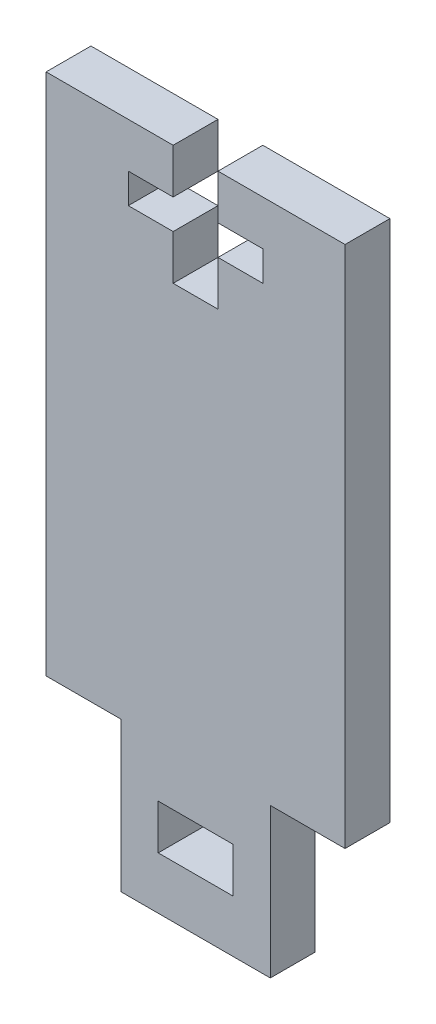
ISO-10303-21;
HEADER;
FILE_DESCRIPTION(('STEP AP214'),'2;1');
FILE_NAME('part.step','',(''),(''),'','','');
FILE_SCHEMA(('AUTOMOTIVE_DESIGN { 1 0 10303 214 1 1 1 1 }'));
ENDSEC;
DATA;
#1=APPLICATION_CONTEXT('core data for automotive mechanical design processes');
#2=APPLICATION_PROTOCOL_DEFINITION('international standard','automotive_design',2000,#1);
#3=PRODUCT_CONTEXT('',#1,'mechanical');
#4=PRODUCT('Part','Part','',(#3));
#5=PRODUCT_RELATED_PRODUCT_CATEGORY('part','',(#4));
#6=PRODUCT_DEFINITION_FORMATION('','',#4);
#7=PRODUCT_DEFINITION_CONTEXT('part definition',#1,'design');
#8=PRODUCT_DEFINITION('design','',#6,#7);
#9=PRODUCT_DEFINITION_SHAPE('','',#8);
#10=(LENGTH_UNIT() NAMED_UNIT(*) SI_UNIT(.MILLI.,.METRE.));
#11=(NAMED_UNIT(*) PLANE_ANGLE_UNIT() SI_UNIT($,.RADIAN.));
#12=(NAMED_UNIT(*) SI_UNIT($,.STERADIAN.) SOLID_ANGLE_UNIT());
#13=UNCERTAINTY_MEASURE_WITH_UNIT(LENGTH_MEASURE(1.E-05),#10,'distance_accuracy_value','');
#14=(GEOMETRIC_REPRESENTATION_CONTEXT(3) GLOBAL_UNCERTAINTY_ASSIGNED_CONTEXT((#13)) GLOBAL_UNIT_ASSIGNED_CONTEXT((#10,
#11,#12)) REPRESENTATION_CONTEXT('',''));
#15=CARTESIAN_POINT('',(0.,0.,0.));
#16=DIRECTION('',(0.,0.,1.));
#17=DIRECTION('',(1.,0.,0.));
#18=AXIS2_PLACEMENT_3D('',#15,#16,#17);
#19=CARTESIAN_POINT('',(0.,0.,3.));
#20=DIRECTION('',(0.,0.,-1.));
#21=DIRECTION('',(-1.,0.,0.));
#22=AXIS2_PLACEMENT_3D('',#19,#20,#21);
#23=PLANE('',#22);
#24=DIRECTION('',(-1.,0.,0.));
#25=VECTOR('',#24,1.);
#26=CARTESIAN_POINT('',(-10.,17.5,3.));
#27=LINE('',#26,#25);
#28=CARTESIAN_POINT('',(-1.5,17.5,3.));
#29=VERTEX_POINT('',#28);
#30=CARTESIAN_POINT('',(-10.,17.5,3.));
#31=VERTEX_POINT('',#30);
#32=EDGE_CURVE('E249',#29,#31,#27,.T.);
#33=ORIENTED_EDGE('',*,*,#32,.T.);
#34=DIRECTION('',(0.,-1.,0.));
#35=VECTOR('',#34,1.);
#36=CARTESIAN_POINT('',(-10.,-17.5,3.));
#37=LINE('',#36,#35);
#38=CARTESIAN_POINT('',(-10.,-17.5,3.));
#39=VERTEX_POINT('',#38);
#40=EDGE_CURVE('E253',#31,#39,#37,.T.);
#41=ORIENTED_EDGE('',*,*,#40,.T.);
#42=DIRECTION('',(1.,0.,0.));
#43=VECTOR('',#42,1.);
#44=CARTESIAN_POINT('',(-5.,-17.5,3.));
#45=LINE('',#44,#43);
#46=CARTESIAN_POINT('',(-5.,-17.5,3.));
#47=VERTEX_POINT('',#46);
#48=EDGE_CURVE('E257',#39,#47,#45,.T.);
#49=ORIENTED_EDGE('',*,*,#48,.T.);
#50=DIRECTION('',(0.,-1.,0.));
#51=VECTOR('',#50,1.);
#52=CARTESIAN_POINT('',(-5.,-27.5,3.));
#53=LINE('',#52,#51);
#54=CARTESIAN_POINT('',(-5.,-27.5,3.));
#55=VERTEX_POINT('',#54);
#56=EDGE_CURVE('E260',#47,#55,#53,.T.);
#57=ORIENTED_EDGE('',*,*,#56,.T.);
#58=DIRECTION('',(1.,0.,0.));
#59=VECTOR('',#58,1.);
#60=CARTESIAN_POINT('',(5.,-27.5,3.));
#61=LINE('',#60,#59);
#62=CARTESIAN_POINT('',(5.,-27.5,3.));
#63=VERTEX_POINT('',#62);
#64=EDGE_CURVE('E263',#55,#63,#61,.T.);
#65=ORIENTED_EDGE('',*,*,#64,.T.);
#66=DIRECTION('',(0.,1.,0.));
#67=VECTOR('',#66,1.);
#68=CARTESIAN_POINT('',(5.,-17.5,3.));
#69=LINE('',#68,#67);
#70=CARTESIAN_POINT('',(5.,-17.5,3.));
#71=VERTEX_POINT('',#70);
#72=EDGE_CURVE('E266',#63,#71,#69,.T.);
#73=ORIENTED_EDGE('',*,*,#72,.T.);
#74=DIRECTION('',(1.,0.,0.));
#75=VECTOR('',#74,1.);
#76=CARTESIAN_POINT('',(10.,-17.5,3.));
#77=LINE('',#76,#75);
#78=CARTESIAN_POINT('',(10.,-17.5,3.));
#79=VERTEX_POINT('',#78);
#80=EDGE_CURVE('E269',#71,#79,#77,.T.);
#81=ORIENTED_EDGE('',*,*,#80,.T.);
#82=DIRECTION('',(0.,1.,0.));
#83=VECTOR('',#82,1.);
#84=CARTESIAN_POINT('',(10.,17.5,3.));
#85=LINE('',#84,#83);
#86=CARTESIAN_POINT('',(10.,17.5,3.));
#87=VERTEX_POINT('',#86);
#88=EDGE_CURVE('E272',#79,#87,#85,.T.);
#89=ORIENTED_EDGE('',*,*,#88,.T.);
#90=DIRECTION('',(-1.,0.,0.));
#91=VECTOR('',#90,1.);
#92=CARTESIAN_POINT('',(1.5,17.5,3.));
#93=LINE('',#92,#91);
#94=CARTESIAN_POINT('',(1.5,17.5,3.));
#95=VERTEX_POINT('',#94);
#96=EDGE_CURVE('E275',#87,#95,#93,.T.);
#97=ORIENTED_EDGE('',*,*,#96,.T.);
#98=DIRECTION('',(0.,-1.,0.));
#99=VECTOR('',#98,1.);
#100=CARTESIAN_POINT('',(1.5,14.5,3.));
#101=LINE('',#100,#99);
#102=CARTESIAN_POINT('',(1.5,14.5,3.));
#103=VERTEX_POINT('',#102);
#104=EDGE_CURVE('E278',#95,#103,#101,.T.);
#105=ORIENTED_EDGE('',*,*,#104,.T.);
#106=DIRECTION('',(1.,0.,0.));
#107=VECTOR('',#106,1.);
#108=CARTESIAN_POINT('',(4.5,14.5,3.));
#109=LINE('',#108,#107);
#110=CARTESIAN_POINT('',(4.5,14.5,3.));
#111=VERTEX_POINT('',#110);
#112=EDGE_CURVE('E281',#103,#111,#109,.T.);
#113=ORIENTED_EDGE('',*,*,#112,.T.);
#114=DIRECTION('',(0.,-1.,0.));
#115=VECTOR('',#114,1.);
#116=CARTESIAN_POINT('',(4.5,12.5,3.));
#117=LINE('',#116,#115);
#118=CARTESIAN_POINT('',(4.5,12.5,3.));
#119=VERTEX_POINT('',#118);
#120=EDGE_CURVE('E284',#111,#119,#117,.T.);
#121=ORIENTED_EDGE('',*,*,#120,.T.);
#122=DIRECTION('',(-1.,0.,0.));
#123=VECTOR('',#122,1.);
#124=CARTESIAN_POINT('',(1.5,12.5,3.));
#125=LINE('',#124,#123);
#126=CARTESIAN_POINT('',(1.5,12.5,3.));
#127=VERTEX_POINT('',#126);
#128=EDGE_CURVE('E287',#119,#127,#125,.T.);
#129=ORIENTED_EDGE('',*,*,#128,.T.);
#130=DIRECTION('',(0.,-1.,0.));
#131=VECTOR('',#130,1.);
#132=CARTESIAN_POINT('',(1.5,9.5,3.));
#133=LINE('',#132,#131);
#134=CARTESIAN_POINT('',(1.5,9.5,3.));
#135=VERTEX_POINT('',#134);
#136=EDGE_CURVE('E290',#127,#135,#133,.T.);
#137=ORIENTED_EDGE('',*,*,#136,.T.);
#138=DIRECTION('',(-1.,0.,0.));
#139=VECTOR('',#138,1.);
#140=CARTESIAN_POINT('',(-1.5,9.5,3.));
#141=LINE('',#140,#139);
#142=CARTESIAN_POINT('',(-1.5,9.5,3.));
#143=VERTEX_POINT('',#142);
#144=EDGE_CURVE('E293',#135,#143,#141,.T.);
#145=ORIENTED_EDGE('',*,*,#144,.T.);
#146=DIRECTION('',(0.,1.,0.));
#147=VECTOR('',#146,1.);
#148=CARTESIAN_POINT('',(-1.5,12.5,3.));
#149=LINE('',#148,#147);
#150=CARTESIAN_POINT('',(-1.5,12.5,3.));
#151=VERTEX_POINT('',#150);
#152=EDGE_CURVE('E296',#143,#151,#149,.T.);
#153=ORIENTED_EDGE('',*,*,#152,.T.);
#154=DIRECTION('',(-1.,0.,0.));
#155=VECTOR('',#154,1.);
#156=CARTESIAN_POINT('',(-4.5,12.5,3.));
#157=LINE('',#156,#155);
#158=CARTESIAN_POINT('',(-4.5,12.5,3.));
#159=VERTEX_POINT('',#158);
#160=EDGE_CURVE('E299',#151,#159,#157,.T.);
#161=ORIENTED_EDGE('',*,*,#160,.T.);
#162=DIRECTION('',(0.,1.,0.));
#163=VECTOR('',#162,1.);
#164=CARTESIAN_POINT('',(-4.5,14.5,3.));
#165=LINE('',#164,#163);
#166=CARTESIAN_POINT('',(-4.5,14.5,3.));
#167=VERTEX_POINT('',#166);
#168=EDGE_CURVE('E302',#159,#167,#165,.T.);
#169=ORIENTED_EDGE('',*,*,#168,.T.);
#170=DIRECTION('',(1.,0.,0.));
#171=VECTOR('',#170,1.);
#172=CARTESIAN_POINT('',(-1.5,14.5,3.));
#173=LINE('',#172,#171);
#174=CARTESIAN_POINT('',(-1.5,14.5,3.));
#175=VERTEX_POINT('',#174);
#176=EDGE_CURVE('E305',#167,#175,#173,.T.);
#177=ORIENTED_EDGE('',*,*,#176,.T.);
#178=DIRECTION('',(0.,1.,0.));
#179=VECTOR('',#178,1.);
#180=CARTESIAN_POINT('',(-1.5,17.5,3.));
#181=LINE('',#180,#179);
#182=EDGE_CURVE('E308',#175,#29,#181,.T.);
#183=ORIENTED_EDGE('',*,*,#182,.T.);
#184=EDGE_LOOP('',(#33,#41,#49,#57,#65,#73,#81,#89,#97,#105,#113,#121,#129,#137,#145,#153,#161,
#169,#177,#183));
#185=FACE_BOUND('',#184,.T.);
#186=DIRECTION('',(0.,1.,0.));
#187=VECTOR('',#186,1.);
#188=CARTESIAN_POINT('',(2.5,-21.,3.));
#189=LINE('',#188,#187);
#190=CARTESIAN_POINT('',(2.5,-24.,3.));
#191=VERTEX_POINT('',#190);
#192=CARTESIAN_POINT('',(2.5,-21.,3.));
#193=VERTEX_POINT('',#192);
#194=EDGE_CURVE('E201',#191,#193,#189,.T.);
#195=ORIENTED_EDGE('',*,*,#194,.F.);
#196=DIRECTION('',(1.,0.,0.));
#197=VECTOR('',#196,1.);
#198=CARTESIAN_POINT('',(-2.5,-24.,3.));
#199=LINE('',#198,#197);
#200=CARTESIAN_POINT('',(-2.5,-24.,3.));
#201=VERTEX_POINT('',#200);
#202=EDGE_CURVE('E227',#201,#191,#199,.T.);
#203=ORIENTED_EDGE('',*,*,#202,.F.);
#204=DIRECTION('',(0.,-1.,0.));
#205=VECTOR('',#204,1.);
#206=CARTESIAN_POINT('',(-2.5,-21.,3.));
#207=LINE('',#206,#205);
#208=CARTESIAN_POINT('',(-2.5,-21.,3.));
#209=VERTEX_POINT('',#208);
#210=EDGE_CURVE('E223',#209,#201,#207,.T.);
#211=ORIENTED_EDGE('',*,*,#210,.F.);
#212=DIRECTION('',(-1.,0.,0.));
#213=VECTOR('',#212,1.);
#214=CARTESIAN_POINT('',(-2.5,-21.,3.));
#215=LINE('',#214,#213);
#216=EDGE_CURVE('E210',#193,#209,#215,.T.);
#217=ORIENTED_EDGE('',*,*,#216,.F.);
#218=EDGE_LOOP('',(#195,#203,#211,#217));
#219=FACE_BOUND('',#218,.T.);
#220=ADVANCED_FACE('F39',(#185,#219),#23,.F.);
#221=CARTESIAN_POINT('',(0.,0.,0.));
#222=DIRECTION('',(0.,0.,-1.));
#223=DIRECTION('',(-1.,0.,0.));
#224=AXIS2_PLACEMENT_3D('',#221,#222,#223);
#225=PLANE('',#224);
#226=DIRECTION('',(-1.,0.,0.));
#227=VECTOR('',#226,1.);
#228=CARTESIAN_POINT('',(-10.,17.5,0.));
#229=LINE('',#228,#227);
#230=CARTESIAN_POINT('',(-1.5,17.5,0.));
#231=VERTEX_POINT('',#230);
#232=CARTESIAN_POINT('',(-10.,17.5,0.));
#233=VERTEX_POINT('',#232);
#234=EDGE_CURVE('E219',#231,#233,#229,.T.);
#235=ORIENTED_EDGE('',*,*,#234,.F.);
#236=DIRECTION('',(0.,1.,0.));
#237=VECTOR('',#236,1.);
#238=CARTESIAN_POINT('',(-1.5,17.5,0.));
#239=LINE('',#238,#237);
#240=CARTESIAN_POINT('',(-1.5,14.5,0.));
#241=VERTEX_POINT('',#240);
#242=EDGE_CURVE('E254',#241,#231,#239,.T.);
#243=ORIENTED_EDGE('',*,*,#242,.F.);
#244=DIRECTION('',(1.,0.,0.));
#245=VECTOR('',#244,1.);
#246=CARTESIAN_POINT('',(-1.5,14.5,0.));
#247=LINE('',#246,#245);
#248=CARTESIAN_POINT('',(-4.5,14.5,0.));
#249=VERTEX_POINT('',#248);
#250=EDGE_CURVE('E366',#249,#241,#247,.T.);
#251=ORIENTED_EDGE('',*,*,#250,.F.);
#252=DIRECTION('',(0.,1.,0.));
#253=VECTOR('',#252,1.);
#254=CARTESIAN_POINT('',(-4.5,14.5,0.));
#255=LINE('',#254,#253);
#256=CARTESIAN_POINT('',(-4.5,12.5,0.));
#257=VERTEX_POINT('',#256);
#258=EDGE_CURVE('E363',#257,#249,#255,.T.);
#259=ORIENTED_EDGE('',*,*,#258,.F.);
#260=DIRECTION('',(-1.,0.,0.));
#261=VECTOR('',#260,1.);
#262=CARTESIAN_POINT('',(-4.5,12.5,0.));
#263=LINE('',#262,#261);
#264=CARTESIAN_POINT('',(-1.5,12.5,0.));
#265=VERTEX_POINT('',#264);
#266=EDGE_CURVE('E360',#265,#257,#263,.T.);
#267=ORIENTED_EDGE('',*,*,#266,.F.);
#268=DIRECTION('',(0.,1.,0.));
#269=VECTOR('',#268,1.);
#270=CARTESIAN_POINT('',(-1.5,12.5,0.));
#271=LINE('',#270,#269);
#272=CARTESIAN_POINT('',(-1.5,9.5,0.));
#273=VERTEX_POINT('',#272);
#274=EDGE_CURVE('E357',#273,#265,#271,.T.);
#275=ORIENTED_EDGE('',*,*,#274,.F.);
#276=DIRECTION('',(-1.,0.,0.));
#277=VECTOR('',#276,1.);
#278=CARTESIAN_POINT('',(-1.5,9.5,0.));
#279=LINE('',#278,#277);
#280=CARTESIAN_POINT('',(1.5,9.5,0.));
#281=VERTEX_POINT('',#280);
#282=EDGE_CURVE('E354',#281,#273,#279,.T.);
#283=ORIENTED_EDGE('',*,*,#282,.F.);
#284=DIRECTION('',(0.,-1.,0.));
#285=VECTOR('',#284,1.);
#286=CARTESIAN_POINT('',(1.5,9.5,0.));
#287=LINE('',#286,#285);
#288=CARTESIAN_POINT('',(1.5,12.5,0.));
#289=VERTEX_POINT('',#288);
#290=EDGE_CURVE('E351',#289,#281,#287,.T.);
#291=ORIENTED_EDGE('',*,*,#290,.F.);
#292=DIRECTION('',(-1.,0.,0.));
#293=VECTOR('',#292,1.);
#294=CARTESIAN_POINT('',(1.5,12.5,0.));
#295=LINE('',#294,#293);
#296=CARTESIAN_POINT('',(4.5,12.5,0.));
#297=VERTEX_POINT('',#296);
#298=EDGE_CURVE('E348',#297,#289,#295,.T.);
#299=ORIENTED_EDGE('',*,*,#298,.F.);
#300=DIRECTION('',(0.,-1.,0.));
#301=VECTOR('',#300,1.);
#302=CARTESIAN_POINT('',(4.5,12.5,0.));
#303=LINE('',#302,#301);
#304=CARTESIAN_POINT('',(4.5,14.5,0.));
#305=VERTEX_POINT('',#304);
#306=EDGE_CURVE('E345',#305,#297,#303,.T.);
#307=ORIENTED_EDGE('',*,*,#306,.F.);
#308=DIRECTION('',(1.,0.,0.));
#309=VECTOR('',#308,1.);
#310=CARTESIAN_POINT('',(4.5,14.5,0.));
#311=LINE('',#310,#309);
#312=CARTESIAN_POINT('',(1.5,14.5,0.));
#313=VERTEX_POINT('',#312);
#314=EDGE_CURVE('E342',#313,#305,#311,.T.);
#315=ORIENTED_EDGE('',*,*,#314,.F.);
#316=DIRECTION('',(0.,-1.,0.));
#317=VECTOR('',#316,1.);
#318=CARTESIAN_POINT('',(1.5,14.5,0.));
#319=LINE('',#318,#317);
#320=CARTESIAN_POINT('',(1.5,17.5,0.));
#321=VERTEX_POINT('',#320);
#322=EDGE_CURVE('E339',#321,#313,#319,.T.);
#323=ORIENTED_EDGE('',*,*,#322,.F.);
#324=DIRECTION('',(-1.,0.,0.));
#325=VECTOR('',#324,1.);
#326=CARTESIAN_POINT('',(1.5,17.5,0.));
#327=LINE('',#326,#325);
#328=CARTESIAN_POINT('',(10.,17.5,0.));
#329=VERTEX_POINT('',#328);
#330=EDGE_CURVE('E336',#329,#321,#327,.T.);
#331=ORIENTED_EDGE('',*,*,#330,.F.);
#332=DIRECTION('',(0.,1.,0.));
#333=VECTOR('',#332,1.);
#334=CARTESIAN_POINT('',(10.,17.5,0.));
#335=LINE('',#334,#333);
#336=CARTESIAN_POINT('',(10.,-17.5,0.));
#337=VERTEX_POINT('',#336);
#338=EDGE_CURVE('E333',#337,#329,#335,.T.);
#339=ORIENTED_EDGE('',*,*,#338,.F.);
#340=DIRECTION('',(1.,0.,0.));
#341=VECTOR('',#340,1.);
#342=CARTESIAN_POINT('',(10.,-17.5,0.));
#343=LINE('',#342,#341);
#344=CARTESIAN_POINT('',(5.,-17.5,0.));
#345=VERTEX_POINT('',#344);
#346=EDGE_CURVE('E330',#345,#337,#343,.T.);
#347=ORIENTED_EDGE('',*,*,#346,.F.);
#348=DIRECTION('',(0.,1.,0.));
#349=VECTOR('',#348,1.);
#350=CARTESIAN_POINT('',(5.,-17.5,0.));
#351=LINE('',#350,#349);
#352=CARTESIAN_POINT('',(5.,-27.5,0.));
#353=VERTEX_POINT('',#352);
#354=EDGE_CURVE('E327',#353,#345,#351,.T.);
#355=ORIENTED_EDGE('',*,*,#354,.F.);
#356=DIRECTION('',(1.,0.,0.));
#357=VECTOR('',#356,1.);
#358=CARTESIAN_POINT('',(5.,-27.5,0.));
#359=LINE('',#358,#357);
#360=CARTESIAN_POINT('',(-5.,-27.5,0.));
#361=VERTEX_POINT('',#360);
#362=EDGE_CURVE('E324',#361,#353,#359,.T.);
#363=ORIENTED_EDGE('',*,*,#362,.F.);
#364=DIRECTION('',(0.,-1.,0.));
#365=VECTOR('',#364,1.);
#366=CARTESIAN_POINT('',(-5.,-27.5,0.));
#367=LINE('',#366,#365);
#368=CARTESIAN_POINT('',(-5.,-17.5,0.));
#369=VERTEX_POINT('',#368);
#370=EDGE_CURVE('E321',#369,#361,#367,.T.);
#371=ORIENTED_EDGE('',*,*,#370,.F.);
#372=DIRECTION('',(1.,0.,0.));
#373=VECTOR('',#372,1.);
#374=CARTESIAN_POINT('',(-5.,-17.5,0.));
#375=LINE('',#374,#373);
#376=CARTESIAN_POINT('',(-10.,-17.5,0.));
#377=VERTEX_POINT('',#376);
#378=EDGE_CURVE('E318',#377,#369,#375,.T.);
#379=ORIENTED_EDGE('',*,*,#378,.F.);
#380=DIRECTION('',(0.,-1.,0.));
#381=VECTOR('',#380,1.);
#382=CARTESIAN_POINT('',(-10.,-17.5,0.));
#383=LINE('',#382,#381);
#384=EDGE_CURVE('E315',#233,#377,#383,.T.);
#385=ORIENTED_EDGE('',*,*,#384,.F.);
#386=EDGE_LOOP('',(#235,#243,#251,#259,#267,#275,#283,#291,#299,#307,#315,#323,#331,#339,#347,
#355,#363,#371,#379,#385));
#387=FACE_BOUND('',#386,.T.);
#388=DIRECTION('',(1.,0.,0.));
#389=VECTOR('',#388,1.);
#390=CARTESIAN_POINT('',(-2.5,-24.,0.));
#391=LINE('',#390,#389);
#392=CARTESIAN_POINT('',(-2.5,-24.,0.));
#393=VERTEX_POINT('',#392);
#394=CARTESIAN_POINT('',(2.5,-24.,0.));
#395=VERTEX_POINT('',#394);
#396=EDGE_CURVE('E211',#393,#395,#391,.T.);
#397=ORIENTED_EDGE('',*,*,#396,.T.);
#398=DIRECTION('',(0.,1.,0.));
#399=VECTOR('',#398,1.);
#400=CARTESIAN_POINT('',(2.5,-21.,0.));
#401=LINE('',#400,#399);
#402=CARTESIAN_POINT('',(2.5,-21.,0.));
#403=VERTEX_POINT('',#402);
#404=EDGE_CURVE('E63',#395,#403,#401,.T.);
#405=ORIENTED_EDGE('',*,*,#404,.T.);
#406=DIRECTION('',(-1.,0.,0.));
#407=VECTOR('',#406,1.);
#408=CARTESIAN_POINT('',(-2.5,-21.,0.));
#409=LINE('',#408,#407);
#410=CARTESIAN_POINT('',(-2.5,-21.,0.));
#411=VERTEX_POINT('',#410);
#412=EDGE_CURVE('E217',#403,#411,#409,.T.);
#413=ORIENTED_EDGE('',*,*,#412,.T.);
#414=DIRECTION('',(0.,-1.,0.));
#415=VECTOR('',#414,1.);
#416=CARTESIAN_POINT('',(-2.5,-21.,0.));
#417=LINE('',#416,#415);
#418=EDGE_CURVE('E236',#411,#393,#417,.T.);
#419=ORIENTED_EDGE('',*,*,#418,.T.);
#420=EDGE_LOOP('',(#397,#405,#413,#419));
#421=FACE_BOUND('',#420,.T.);
#422=ADVANCED_FACE('F453',(#387,#421),#225,.T.);
#423=CARTESIAN_POINT('',(-10.,17.5,3.));
#424=DIRECTION('',(0.,-1.,0.));
#425=DIRECTION('',(0.,0.,-1.));
#426=AXIS2_PLACEMENT_3D('',#423,#424,#425);
#427=PLANE('',#426);
#428=ORIENTED_EDGE('',*,*,#234,.T.);
#429=DIRECTION('',(0.,0.,-1.));
#430=VECTOR('',#429,1.);
#431=CARTESIAN_POINT('',(-10.,17.5,3.));
#432=LINE('',#431,#430);
#433=EDGE_CURVE('E11',#31,#233,#432,.T.);
#434=ORIENTED_EDGE('',*,*,#433,.F.);
#435=ORIENTED_EDGE('',*,*,#32,.F.);
#436=DIRECTION('',(0.,0.,-1.));
#437=VECTOR('',#436,1.);
#438=CARTESIAN_POINT('',(-1.5,17.5,3.));
#439=LINE('',#438,#437);
#440=EDGE_CURVE('E311',#29,#231,#439,.T.);
#441=ORIENTED_EDGE('',*,*,#440,.T.);
#442=EDGE_LOOP('',(#428,#434,#435,#441));
#443=FACE_BOUND('',#442,.T.);
#444=ADVANCED_FACE('F41',(#443),#427,.F.);
#445=CARTESIAN_POINT('',(-10.,-17.5,3.));
#446=DIRECTION('',(1.,0.,0.));
#447=DIRECTION('',(0.,1.,0.));
#448=AXIS2_PLACEMENT_3D('',#445,#446,#447);
#449=PLANE('',#448);
#450=ORIENTED_EDGE('',*,*,#384,.T.);
#451=DIRECTION('',(0.,0.,-1.));
#452=VECTOR('',#451,1.);
#453=CARTESIAN_POINT('',(-10.,-17.5,3.));
#454=LINE('',#453,#452);
#455=EDGE_CURVE('E48',#39,#377,#454,.T.);
#456=ORIENTED_EDGE('',*,*,#455,.F.);
#457=ORIENTED_EDGE('',*,*,#40,.F.);
#458=ORIENTED_EDGE('',*,*,#433,.T.);
#459=EDGE_LOOP('',(#450,#456,#457,#458));
#460=FACE_BOUND('',#459,.T.);
#461=ADVANCED_FACE('F470',(#460),#449,.F.);
#462=CARTESIAN_POINT('',(-5.,-17.5,3.));
#463=DIRECTION('',(0.,1.,0.));
#464=DIRECTION('',(0.,0.,1.));
#465=AXIS2_PLACEMENT_3D('',#462,#463,#464);
#466=PLANE('',#465);
#467=ORIENTED_EDGE('',*,*,#378,.T.);
#468=DIRECTION('',(0.,0.,-1.));
#469=VECTOR('',#468,1.);
#470=CARTESIAN_POINT('',(-5.,-17.5,3.));
#471=LINE('',#470,#469);
#472=EDGE_CURVE('E438',#47,#369,#471,.T.);
#473=ORIENTED_EDGE('',*,*,#472,.F.);
#474=ORIENTED_EDGE('',*,*,#48,.F.);
#475=ORIENTED_EDGE('',*,*,#455,.T.);
#476=EDGE_LOOP('',(#467,#473,#474,#475));
#477=FACE_BOUND('',#476,.T.);
#478=ADVANCED_FACE('F447',(#477),#466,.F.);
#479=CARTESIAN_POINT('',(-5.,-27.5,3.));
#480=DIRECTION('',(1.,0.,0.));
#481=DIRECTION('',(0.,1.,0.));
#482=AXIS2_PLACEMENT_3D('',#479,#480,#481);
#483=PLANE('',#482);
#484=ORIENTED_EDGE('',*,*,#370,.T.);
#485=DIRECTION('',(0.,0.,-1.));
#486=VECTOR('',#485,1.);
#487=CARTESIAN_POINT('',(-5.,-27.5,3.));
#488=LINE('',#487,#486);
#489=EDGE_CURVE('E434',#55,#361,#488,.T.);
#490=ORIENTED_EDGE('',*,*,#489,.F.);
#491=ORIENTED_EDGE('',*,*,#56,.F.);
#492=ORIENTED_EDGE('',*,*,#472,.T.);
#493=EDGE_LOOP('',(#484,#490,#491,#492));
#494=FACE_BOUND('',#493,.T.);
#495=ADVANCED_FACE('F459',(#494),#483,.F.);
#496=CARTESIAN_POINT('',(5.,-27.5,3.));
#497=DIRECTION('',(0.,1.,0.));
#498=DIRECTION('',(0.,0.,1.));
#499=AXIS2_PLACEMENT_3D('',#496,#497,#498);
#500=PLANE('',#499);
#501=ORIENTED_EDGE('',*,*,#362,.T.);
#502=DIRECTION('',(0.,0.,-1.));
#503=VECTOR('',#502,1.);
#504=CARTESIAN_POINT('',(5.,-27.5,3.));
#505=LINE('',#504,#503);
#506=EDGE_CURVE('E430',#63,#353,#505,.T.);
#507=ORIENTED_EDGE('',*,*,#506,.F.);
#508=ORIENTED_EDGE('',*,*,#64,.F.);
#509=ORIENTED_EDGE('',*,*,#489,.T.);
#510=EDGE_LOOP('',(#501,#507,#508,#509));
#511=FACE_BOUND('',#510,.T.);
#512=ADVANCED_FACE('F463',(#511),#500,.F.);
#513=CARTESIAN_POINT('',(5.,-17.5,3.));
#514=DIRECTION('',(-1.,0.,0.));
#515=DIRECTION('',(0.,-1.,0.));
#516=AXIS2_PLACEMENT_3D('',#513,#514,#515);
#517=PLANE('',#516);
#518=ORIENTED_EDGE('',*,*,#354,.T.);
#519=DIRECTION('',(0.,0.,-1.));
#520=VECTOR('',#519,1.);
#521=CARTESIAN_POINT('',(5.,-17.5,3.));
#522=LINE('',#521,#520);
#523=EDGE_CURVE('E426',#71,#345,#522,.T.);
#524=ORIENTED_EDGE('',*,*,#523,.F.);
#525=ORIENTED_EDGE('',*,*,#72,.F.);
#526=ORIENTED_EDGE('',*,*,#506,.T.);
#527=EDGE_LOOP('',(#518,#524,#525,#526));
#528=FACE_BOUND('',#527,.T.);
#529=ADVANCED_FACE('F543',(#528),#517,.F.);
#530=CARTESIAN_POINT('',(10.,-17.5,3.));
#531=DIRECTION('',(0.,1.,0.));
#532=DIRECTION('',(0.,0.,1.));
#533=AXIS2_PLACEMENT_3D('',#530,#531,#532);
#534=PLANE('',#533);
#535=ORIENTED_EDGE('',*,*,#346,.T.);
#536=DIRECTION('',(0.,0.,-1.));
#537=VECTOR('',#536,1.);
#538=CARTESIAN_POINT('',(10.,-17.5,3.));
#539=LINE('',#538,#537);
#540=EDGE_CURVE('E422',#79,#337,#539,.T.);
#541=ORIENTED_EDGE('',*,*,#540,.F.);
#542=ORIENTED_EDGE('',*,*,#80,.F.);
#543=ORIENTED_EDGE('',*,*,#523,.T.);
#544=EDGE_LOOP('',(#535,#541,#542,#543));
#545=FACE_BOUND('',#544,.T.);
#546=ADVANCED_FACE('F541',(#545),#534,.F.);
#547=CARTESIAN_POINT('',(10.,17.5,3.));
#548=DIRECTION('',(-1.,0.,0.));
#549=DIRECTION('',(0.,-1.,0.));
#550=AXIS2_PLACEMENT_3D('',#547,#548,#549);
#551=PLANE('',#550);
#552=ORIENTED_EDGE('',*,*,#338,.T.);
#553=DIRECTION('',(0.,0.,-1.));
#554=VECTOR('',#553,1.);
#555=CARTESIAN_POINT('',(10.,17.5,3.));
#556=LINE('',#555,#554);
#557=EDGE_CURVE('E418',#87,#329,#556,.T.);
#558=ORIENTED_EDGE('',*,*,#557,.F.);
#559=ORIENTED_EDGE('',*,*,#88,.F.);
#560=ORIENTED_EDGE('',*,*,#540,.T.);
#561=EDGE_LOOP('',(#552,#558,#559,#560));
#562=FACE_BOUND('',#561,.T.);
#563=ADVANCED_FACE('F536',(#562),#551,.F.);
#564=CARTESIAN_POINT('',(1.5,17.5,3.));
#565=DIRECTION('',(0.,-1.,0.));
#566=DIRECTION('',(0.,0.,-1.));
#567=AXIS2_PLACEMENT_3D('',#564,#565,#566);
#568=PLANE('',#567);
#569=ORIENTED_EDGE('',*,*,#330,.T.);
#570=DIRECTION('',(0.,0.,-1.));
#571=VECTOR('',#570,1.);
#572=CARTESIAN_POINT('',(1.5,17.5,3.));
#573=LINE('',#572,#571);
#574=EDGE_CURVE('E414',#95,#321,#573,.T.);
#575=ORIENTED_EDGE('',*,*,#574,.F.);
#576=ORIENTED_EDGE('',*,*,#96,.F.);
#577=ORIENTED_EDGE('',*,*,#557,.T.);
#578=EDGE_LOOP('',(#569,#575,#576,#577));
#579=FACE_BOUND('',#578,.T.);
#580=ADVANCED_FACE('F531',(#579),#568,.F.);
#581=CARTESIAN_POINT('',(1.5,14.5,3.));
#582=DIRECTION('',(1.,0.,0.));
#583=DIRECTION('',(0.,1.,0.));
#584=AXIS2_PLACEMENT_3D('',#581,#582,#583);
#585=PLANE('',#584);
#586=ORIENTED_EDGE('',*,*,#322,.T.);
#587=DIRECTION('',(0.,0.,-1.));
#588=VECTOR('',#587,1.);
#589=CARTESIAN_POINT('',(1.5,14.5,3.));
#590=LINE('',#589,#588);
#591=EDGE_CURVE('E410',#103,#313,#590,.T.);
#592=ORIENTED_EDGE('',*,*,#591,.F.);
#593=ORIENTED_EDGE('',*,*,#104,.F.);
#594=ORIENTED_EDGE('',*,*,#574,.T.);
#595=EDGE_LOOP('',(#586,#592,#593,#594));
#596=FACE_BOUND('',#595,.T.);
#597=ADVANCED_FACE('F527',(#596),#585,.F.);
#598=CARTESIAN_POINT('',(4.5,14.5,3.));
#599=DIRECTION('',(0.,1.,0.));
#600=DIRECTION('',(0.,0.,1.));
#601=AXIS2_PLACEMENT_3D('',#598,#599,#600);
#602=PLANE('',#601);
#603=ORIENTED_EDGE('',*,*,#314,.T.);
#604=DIRECTION('',(0.,0.,-1.));
#605=VECTOR('',#604,1.);
#606=CARTESIAN_POINT('',(4.5,14.5,3.));
#607=LINE('',#606,#605);
#608=EDGE_CURVE('E406',#111,#305,#607,.T.);
#609=ORIENTED_EDGE('',*,*,#608,.F.);
#610=ORIENTED_EDGE('',*,*,#112,.F.);
#611=ORIENTED_EDGE('',*,*,#591,.T.);
#612=EDGE_LOOP('',(#603,#609,#610,#611));
#613=FACE_BOUND('',#612,.T.);
#614=ADVANCED_FACE('F522',(#613),#602,.F.);
#615=CARTESIAN_POINT('',(4.5,12.5,3.));
#616=DIRECTION('',(1.,0.,0.));
#617=DIRECTION('',(0.,1.,0.));
#618=AXIS2_PLACEMENT_3D('',#615,#616,#617);
#619=PLANE('',#618);
#620=ORIENTED_EDGE('',*,*,#306,.T.);
#621=DIRECTION('',(0.,0.,-1.));
#622=VECTOR('',#621,1.);
#623=CARTESIAN_POINT('',(4.5,12.5,3.));
#624=LINE('',#623,#622);
#625=EDGE_CURVE('E402',#119,#297,#624,.T.);
#626=ORIENTED_EDGE('',*,*,#625,.F.);
#627=ORIENTED_EDGE('',*,*,#120,.F.);
#628=ORIENTED_EDGE('',*,*,#608,.T.);
#629=EDGE_LOOP('',(#620,#626,#627,#628));
#630=FACE_BOUND('',#629,.T.);
#631=ADVANCED_FACE('F516',(#630),#619,.F.);
#632=CARTESIAN_POINT('',(1.5,12.5,3.));
#633=DIRECTION('',(0.,-1.,0.));
#634=DIRECTION('',(0.,0.,-1.));
#635=AXIS2_PLACEMENT_3D('',#632,#633,#634);
#636=PLANE('',#635);
#637=ORIENTED_EDGE('',*,*,#298,.T.);
#638=DIRECTION('',(0.,0.,-1.));
#639=VECTOR('',#638,1.);
#640=CARTESIAN_POINT('',(1.5,12.5,3.));
#641=LINE('',#640,#639);
#642=EDGE_CURVE('E398',#127,#289,#641,.T.);
#643=ORIENTED_EDGE('',*,*,#642,.F.);
#644=ORIENTED_EDGE('',*,*,#128,.F.);
#645=ORIENTED_EDGE('',*,*,#625,.T.);
#646=EDGE_LOOP('',(#637,#643,#644,#645));
#647=FACE_BOUND('',#646,.T.);
#648=ADVANCED_FACE('F512',(#647),#636,.F.);
#649=CARTESIAN_POINT('',(1.5,9.5,3.));
#650=DIRECTION('',(1.,0.,0.));
#651=DIRECTION('',(0.,0.,-1.));
#652=AXIS2_PLACEMENT_3D('',#649,#650,#651);
#653=PLANE('',#652);
#654=ORIENTED_EDGE('',*,*,#290,.T.);
#655=DIRECTION('',(0.,0.,-1.));
#656=VECTOR('',#655,1.);
#657=CARTESIAN_POINT('',(1.5,9.5,3.));
#658=LINE('',#657,#656);
#659=EDGE_CURVE('E394',#135,#281,#658,.T.);
#660=ORIENTED_EDGE('',*,*,#659,.F.);
#661=ORIENTED_EDGE('',*,*,#136,.F.);
#662=ORIENTED_EDGE('',*,*,#642,.T.);
#663=EDGE_LOOP('',(#654,#660,#661,#662));
#664=FACE_BOUND('',#663,.T.);
#665=ADVANCED_FACE('F507',(#664),#653,.F.);
#666=CARTESIAN_POINT('',(-1.5,9.5,3.));
#667=DIRECTION('',(0.,-1.,0.));
#668=DIRECTION('',(0.,0.,-1.));
#669=AXIS2_PLACEMENT_3D('',#666,#667,#668);
#670=PLANE('',#669);
#671=ORIENTED_EDGE('',*,*,#282,.T.);
#672=DIRECTION('',(0.,0.,-1.));
#673=VECTOR('',#672,1.);
#674=CARTESIAN_POINT('',(-1.5,9.5,3.));
#675=LINE('',#674,#673);
#676=EDGE_CURVE('E390',#143,#273,#675,.T.);
#677=ORIENTED_EDGE('',*,*,#676,.F.);
#678=ORIENTED_EDGE('',*,*,#144,.F.);
#679=ORIENTED_EDGE('',*,*,#659,.T.);
#680=EDGE_LOOP('',(#671,#677,#678,#679));
#681=FACE_BOUND('',#680,.T.);
#682=ADVANCED_FACE('F501',(#681),#670,.F.);
#683=CARTESIAN_POINT('',(-1.5,12.5,3.));
#684=DIRECTION('',(-1.,0.,0.));
#685=DIRECTION('',(0.,0.,1.));
#686=AXIS2_PLACEMENT_3D('',#683,#684,#685);
#687=PLANE('',#686);
#688=ORIENTED_EDGE('',*,*,#274,.T.);
#689=DIRECTION('',(0.,0.,-1.));
#690=VECTOR('',#689,1.);
#691=CARTESIAN_POINT('',(-1.5,12.5,3.));
#692=LINE('',#691,#690);
#693=EDGE_CURVE('E386',#151,#265,#692,.T.);
#694=ORIENTED_EDGE('',*,*,#693,.F.);
#695=ORIENTED_EDGE('',*,*,#152,.F.);
#696=ORIENTED_EDGE('',*,*,#676,.T.);
#697=EDGE_LOOP('',(#688,#694,#695,#696));
#698=FACE_BOUND('',#697,.T.);
#699=ADVANCED_FACE('F497',(#698),#687,.F.);
#700=CARTESIAN_POINT('',(-4.5,12.5,3.));
#701=DIRECTION('',(0.,-1.,0.));
#702=DIRECTION('',(0.,0.,-1.));
#703=AXIS2_PLACEMENT_3D('',#700,#701,#702);
#704=PLANE('',#703);
#705=ORIENTED_EDGE('',*,*,#266,.T.);
#706=DIRECTION('',(0.,0.,-1.));
#707=VECTOR('',#706,1.);
#708=CARTESIAN_POINT('',(-4.5,12.5,3.));
#709=LINE('',#708,#707);
#710=EDGE_CURVE('E382',#159,#257,#709,.T.);
#711=ORIENTED_EDGE('',*,*,#710,.F.);
#712=ORIENTED_EDGE('',*,*,#160,.F.);
#713=ORIENTED_EDGE('',*,*,#693,.T.);
#714=EDGE_LOOP('',(#705,#711,#712,#713));
#715=FACE_BOUND('',#714,.T.);
#716=ADVANCED_FACE('F492',(#715),#704,.F.);
#717=CARTESIAN_POINT('',(-4.5,14.5,3.));
#718=DIRECTION('',(-1.,0.,0.));
#719=DIRECTION('',(0.,-1.,0.));
#720=AXIS2_PLACEMENT_3D('',#717,#718,#719);
#721=PLANE('',#720);
#722=ORIENTED_EDGE('',*,*,#258,.T.);
#723=DIRECTION('',(0.,0.,-1.));
#724=VECTOR('',#723,1.);
#725=CARTESIAN_POINT('',(-4.5,14.5,3.));
#726=LINE('',#725,#724);
#727=EDGE_CURVE('E378',#167,#249,#726,.T.);
#728=ORIENTED_EDGE('',*,*,#727,.F.);
#729=ORIENTED_EDGE('',*,*,#168,.F.);
#730=ORIENTED_EDGE('',*,*,#710,.T.);
#731=EDGE_LOOP('',(#722,#728,#729,#730));
#732=FACE_BOUND('',#731,.T.);
#733=ADVANCED_FACE('F486',(#732),#721,.F.);
#734=CARTESIAN_POINT('',(-1.5,14.5,3.));
#735=DIRECTION('',(0.,1.,0.));
#736=DIRECTION('',(0.,0.,1.));
#737=AXIS2_PLACEMENT_3D('',#734,#735,#736);
#738=PLANE('',#737);
#739=ORIENTED_EDGE('',*,*,#250,.T.);
#740=DIRECTION('',(0.,0.,-1.));
#741=VECTOR('',#740,1.);
#742=CARTESIAN_POINT('',(-1.5,14.5,3.));
#743=LINE('',#742,#741);
#744=EDGE_CURVE('E374',#175,#241,#743,.T.);
#745=ORIENTED_EDGE('',*,*,#744,.F.);
#746=ORIENTED_EDGE('',*,*,#176,.F.);
#747=ORIENTED_EDGE('',*,*,#727,.T.);
#748=EDGE_LOOP('',(#739,#745,#746,#747));
#749=FACE_BOUND('',#748,.T.);
#750=ADVANCED_FACE('F482',(#749),#738,.F.);
#751=CARTESIAN_POINT('',(-1.5,17.5,3.));
#752=DIRECTION('',(-1.,0.,0.));
#753=DIRECTION('',(0.,-1.,0.));
#754=AXIS2_PLACEMENT_3D('',#751,#752,#753);
#755=PLANE('',#754);
#756=ORIENTED_EDGE('',*,*,#242,.T.);
#757=ORIENTED_EDGE('',*,*,#440,.F.);
#758=ORIENTED_EDGE('',*,*,#182,.F.);
#759=ORIENTED_EDGE('',*,*,#744,.T.);
#760=EDGE_LOOP('',(#756,#757,#758,#759));
#761=FACE_BOUND('',#760,.T.);
#762=ADVANCED_FACE('F477',(#761),#755,.F.);
#763=CARTESIAN_POINT('',(2.5,-21.,3.));
#764=DIRECTION('',(-1.,0.,0.));
#765=DIRECTION('',(0.,-1.,0.));
#766=AXIS2_PLACEMENT_3D('',#763,#764,#765);
#767=PLANE('',#766);
#768=ORIENTED_EDGE('',*,*,#404,.F.);
#769=DIRECTION('',(0.,0.,-1.));
#770=VECTOR('',#769,1.);
#771=CARTESIAN_POINT('',(2.5,-24.,3.));
#772=LINE('',#771,#770);
#773=EDGE_CURVE('E205',#191,#395,#772,.T.);
#774=ORIENTED_EDGE('',*,*,#773,.F.);
#775=ORIENTED_EDGE('',*,*,#194,.T.);
#776=DIRECTION('',(0.,0.,-1.));
#777=VECTOR('',#776,1.);
#778=CARTESIAN_POINT('',(2.5,-21.,3.));
#779=LINE('',#778,#777);
#780=EDGE_CURVE('E204',#193,#403,#779,.T.);
#781=ORIENTED_EDGE('',*,*,#780,.T.);
#782=EDGE_LOOP('',(#768,#774,#775,#781));
#783=FACE_BOUND('',#782,.T.);
#784=ADVANCED_FACE('F203',(#783),#767,.T.);
#785=CARTESIAN_POINT('',(-2.5,-21.,3.));
#786=DIRECTION('',(0.,-1.,0.));
#787=DIRECTION('',(0.,0.,-1.));
#788=AXIS2_PLACEMENT_3D('',#785,#786,#787);
#789=PLANE('',#788);
#790=ORIENTED_EDGE('',*,*,#412,.F.);
#791=ORIENTED_EDGE('',*,*,#780,.F.);
#792=ORIENTED_EDGE('',*,*,#216,.T.);
#793=DIRECTION('',(0.,0.,-1.));
#794=VECTOR('',#793,1.);
#795=CARTESIAN_POINT('',(-2.5,-21.,3.));
#796=LINE('',#795,#794);
#797=EDGE_CURVE('E220',#209,#411,#796,.T.);
#798=ORIENTED_EDGE('',*,*,#797,.T.);
#799=EDGE_LOOP('',(#790,#791,#792,#798));
#800=FACE_BOUND('',#799,.T.);
#801=ADVANCED_FACE('F214',(#800),#789,.T.);
#802=CARTESIAN_POINT('',(-2.5,-21.,3.));
#803=DIRECTION('',(1.,0.,0.));
#804=DIRECTION('',(0.,0.,-1.));
#805=AXIS2_PLACEMENT_3D('',#802,#803,#804);
#806=PLANE('',#805);
#807=ORIENTED_EDGE('',*,*,#418,.F.);
#808=ORIENTED_EDGE('',*,*,#797,.F.);
#809=ORIENTED_EDGE('',*,*,#210,.T.);
#810=DIRECTION('',(0.,0.,-1.));
#811=VECTOR('',#810,1.);
#812=CARTESIAN_POINT('',(-2.5,-24.,3.));
#813=LINE('',#812,#811);
#814=EDGE_CURVE('E55',#201,#393,#813,.T.);
#815=ORIENTED_EDGE('',*,*,#814,.T.);
#816=EDGE_LOOP('',(#807,#808,#809,#815));
#817=FACE_BOUND('',#816,.T.);
#818=ADVANCED_FACE('F649',(#817),#806,.T.);
#819=CARTESIAN_POINT('',(-2.5,-24.,3.));
#820=DIRECTION('',(0.,1.,0.));
#821=DIRECTION('',(-1.,0.,0.));
#822=AXIS2_PLACEMENT_3D('',#819,#820,#821);
#823=PLANE('',#822);
#824=ORIENTED_EDGE('',*,*,#396,.F.);
#825=ORIENTED_EDGE('',*,*,#814,.F.);
#826=ORIENTED_EDGE('',*,*,#202,.T.);
#827=ORIENTED_EDGE('',*,*,#773,.T.);
#828=EDGE_LOOP('',(#824,#825,#826,#827));
#829=FACE_BOUND('',#828,.T.);
#830=ADVANCED_FACE('F655',(#829),#823,.T.);
#831=CLOSED_SHELL('',(#220,#422,#444,#461,#478,#495,#512,#529,#546,#563,#580,#597,#614,#631,
#648,#665,#682,#699,#716,#733,#750,#762,#784,#801,#818,#830));
#832=MANIFOLD_SOLID_BREP('B2',#831);
#833=ADVANCED_BREP_SHAPE_REPRESENTATION('',(#18,#832),#14);
#834=SHAPE_DEFINITION_REPRESENTATION(#9,#833);
ENDSEC;
END-ISO-10303-21;
